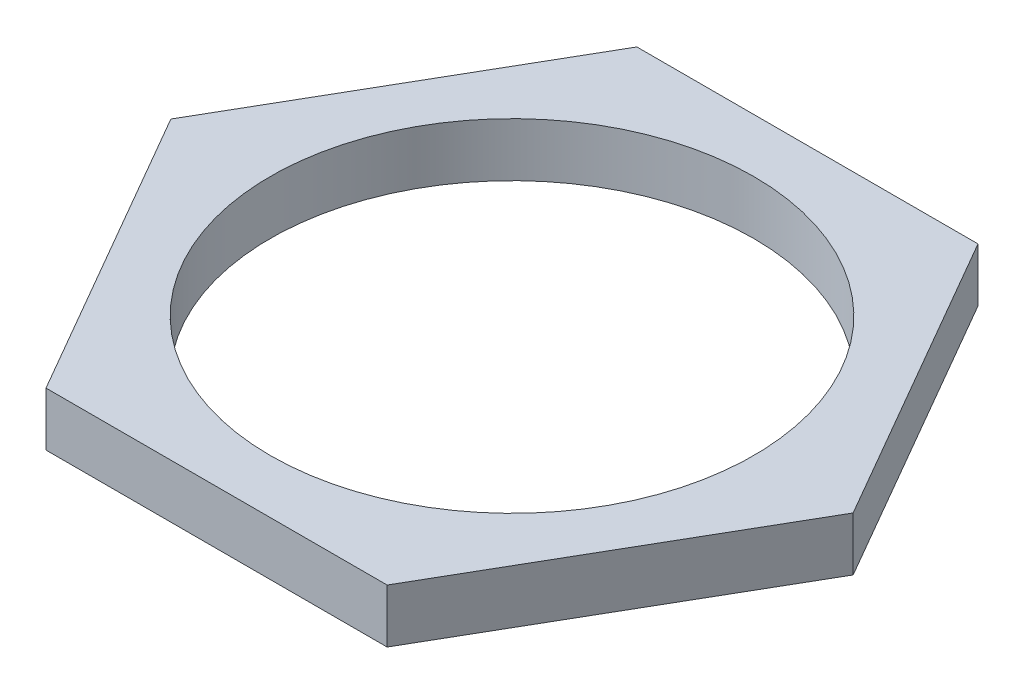
ISO-10303-21;
HEADER;
FILE_DESCRIPTION(('STEP AP214'),'2;1');
FILE_NAME('part.step','',(''),(''),'','','');
FILE_SCHEMA(('AUTOMOTIVE_DESIGN { 1 0 10303 214 1 1 1 1 }'));
ENDSEC;
DATA;
#1=APPLICATION_CONTEXT('core data for automotive mechanical design processes');
#2=APPLICATION_PROTOCOL_DEFINITION('international standard','automotive_design',2000,#1);
#3=PRODUCT_CONTEXT('',#1,'mechanical');
#4=PRODUCT('Part','Part','',(#3));
#5=PRODUCT_RELATED_PRODUCT_CATEGORY('part','',(#4));
#6=PRODUCT_DEFINITION_FORMATION('','',#4);
#7=PRODUCT_DEFINITION_CONTEXT('part definition',#1,'design');
#8=PRODUCT_DEFINITION('design','',#6,#7);
#9=PRODUCT_DEFINITION_SHAPE('','',#8);
#10=(LENGTH_UNIT() NAMED_UNIT(*) SI_UNIT(.MILLI.,.METRE.));
#11=(NAMED_UNIT(*) PLANE_ANGLE_UNIT() SI_UNIT($,.RADIAN.));
#12=(NAMED_UNIT(*) SI_UNIT($,.STERADIAN.) SOLID_ANGLE_UNIT());
#13=UNCERTAINTY_MEASURE_WITH_UNIT(LENGTH_MEASURE(1.E-05),#10,'distance_accuracy_value','');
#14=(GEOMETRIC_REPRESENTATION_CONTEXT(3) GLOBAL_UNCERTAINTY_ASSIGNED_CONTEXT((#13)) GLOBAL_UNIT_ASSIGNED_CONTEXT((#10,
#11,#12)) REPRESENTATION_CONTEXT('',''));
#15=CARTESIAN_POINT('',(0.,0.,0.));
#16=DIRECTION('',(0.,0.,1.));
#17=DIRECTION('',(1.,0.,0.));
#18=AXIS2_PLACEMENT_3D('',#15,#16,#17);
#19=CARTESIAN_POINT('',(0.,2.,0.));
#20=DIRECTION('',(0.,1.,0.));
#21=DIRECTION('',(0.,0.,1.));
#22=AXIS2_PLACEMENT_3D('',#19,#20,#21);
#23=PLANE('',#22);
#24=DIRECTION('',(1.,0.,0.));
#25=VECTOR('',#24,1.);
#26=CARTESIAN_POINT('',(-6.35085296108588,2.,11.));
#27=LINE('',#26,#25);
#28=CARTESIAN_POINT('',(-6.35085296108588,2.,11.));
#29=VERTEX_POINT('',#28);
#30=CARTESIAN_POINT('',(6.35085296108589,2.,11.));
#31=VERTEX_POINT('',#30);
#32=EDGE_CURVE('E130',#29,#31,#27,.T.);
#33=ORIENTED_EDGE('',*,*,#32,.T.);
#34=DIRECTION('',(0.5,0.,-0.866025403784439));
#35=VECTOR('',#34,1.);
#36=CARTESIAN_POINT('',(6.35085296108589,2.,11.));
#37=LINE('',#36,#35);
#38=CARTESIAN_POINT('',(12.7017059221718,2.,0.));
#39=VERTEX_POINT('',#38);
#40=EDGE_CURVE('E88',#31,#39,#37,.T.);
#41=ORIENTED_EDGE('',*,*,#40,.T.);
#42=DIRECTION('',(-0.5,0.,-0.866025403784439));
#43=VECTOR('',#42,1.);
#44=CARTESIAN_POINT('',(12.7017059221718,2.,0.));
#45=LINE('',#44,#43);
#46=CARTESIAN_POINT('',(6.35085296108589,2.,-11.));
#47=VERTEX_POINT('',#46);
#48=EDGE_CURVE('E101',#39,#47,#45,.T.);
#49=ORIENTED_EDGE('',*,*,#48,.T.);
#50=DIRECTION('',(-1.,0.,0.));
#51=VECTOR('',#50,1.);
#52=CARTESIAN_POINT('',(6.35085296108589,2.,-11.));
#53=LINE('',#52,#51);
#54=CARTESIAN_POINT('',(-6.35085296108588,2.,-11.));
#55=VERTEX_POINT('',#54);
#56=EDGE_CURVE('E95',#47,#55,#53,.T.);
#57=ORIENTED_EDGE('',*,*,#56,.T.);
#58=DIRECTION('',(-0.5,0.,0.866025403784439));
#59=VECTOR('',#58,1.);
#60=CARTESIAN_POINT('',(-6.35085296108588,2.,-11.));
#61=LINE('',#60,#59);
#62=CARTESIAN_POINT('',(-12.7017059221718,2.,0.));
#63=VERTEX_POINT('',#62);
#64=EDGE_CURVE('E99',#55,#63,#61,.T.);
#65=ORIENTED_EDGE('',*,*,#64,.T.);
#66=DIRECTION('',(0.5,0.,0.866025403784439));
#67=VECTOR('',#66,1.);
#68=CARTESIAN_POINT('',(-12.7017059221718,2.,0.));
#69=LINE('',#68,#67);
#70=EDGE_CURVE('E51',#63,#29,#69,.T.);
#71=ORIENTED_EDGE('',*,*,#70,.T.);
#72=EDGE_LOOP('',(#33,#41,#49,#57,#65,#71));
#73=FACE_BOUND('',#72,.T.);
#74=CARTESIAN_POINT('',(0.,2.,0.));
#75=DIRECTION('',(0.,1.,0.));
#76=DIRECTION('',(0.,0.,1.));
#77=AXIS2_PLACEMENT_3D('',#74,#75,#76);
#78=CIRCLE('',#77,9.);
#79=CARTESIAN_POINT('',(0.,2.,9.));
#80=VERTEX_POINT('',#79);
#81=EDGE_CURVE('E123',#80,#80,#78,.T.);
#82=ORIENTED_EDGE('',*,*,#81,.F.);
#83=EDGE_LOOP('',(#82));
#84=FACE_BOUND('',#83,.T.);
#85=ADVANCED_FACE('F34',(#73,#84),#23,.T.);
#86=CARTESIAN_POINT('',(0.,0.,0.));
#87=DIRECTION('',(0.,1.,0.));
#88=DIRECTION('',(0.,0.,1.));
#89=AXIS2_PLACEMENT_3D('',#86,#87,#88);
#90=PLANE('',#89);
#91=DIRECTION('',(1.,0.,0.));
#92=VECTOR('',#91,1.);
#93=CARTESIAN_POINT('',(-6.35085296108588,0.,11.));
#94=LINE('',#93,#92);
#95=CARTESIAN_POINT('',(-6.35085296108588,0.,11.));
#96=VERTEX_POINT('',#95);
#97=CARTESIAN_POINT('',(6.35085296108589,0.,11.));
#98=VERTEX_POINT('',#97);
#99=EDGE_CURVE('E119',#96,#98,#94,.T.);
#100=ORIENTED_EDGE('',*,*,#99,.F.);
#101=DIRECTION('',(0.5,0.,0.866025403784439));
#102=VECTOR('',#101,1.);
#103=CARTESIAN_POINT('',(-12.7017059221718,0.,0.));
#104=LINE('',#103,#102);
#105=CARTESIAN_POINT('',(-12.7017059221718,0.,0.));
#106=VERTEX_POINT('',#105);
#107=EDGE_CURVE('E80',#106,#96,#104,.T.);
#108=ORIENTED_EDGE('',*,*,#107,.F.);
#109=DIRECTION('',(-0.5,0.,0.866025403784439));
#110=VECTOR('',#109,1.);
#111=CARTESIAN_POINT('',(-6.35085296108588,0.,-11.));
#112=LINE('',#111,#110);
#113=CARTESIAN_POINT('',(-6.35085296108588,0.,-11.));
#114=VERTEX_POINT('',#113);
#115=EDGE_CURVE('E74',#114,#106,#112,.T.);
#116=ORIENTED_EDGE('',*,*,#115,.F.);
#117=DIRECTION('',(-1.,0.,0.));
#118=VECTOR('',#117,1.);
#119=CARTESIAN_POINT('',(6.35085296108589,0.,-11.));
#120=LINE('',#119,#118);
#121=CARTESIAN_POINT('',(6.35085296108589,0.,-11.));
#122=VERTEX_POINT('',#121);
#123=EDGE_CURVE('E109',#122,#114,#120,.T.);
#124=ORIENTED_EDGE('',*,*,#123,.F.);
#125=DIRECTION('',(-0.5,0.,-0.866025403784439));
#126=VECTOR('',#125,1.);
#127=CARTESIAN_POINT('',(12.7017059221718,0.,0.));
#128=LINE('',#127,#126);
#129=CARTESIAN_POINT('',(12.7017059221718,0.,0.));
#130=VERTEX_POINT('',#129);
#131=EDGE_CURVE('E125',#130,#122,#128,.T.);
#132=ORIENTED_EDGE('',*,*,#131,.F.);
#133=DIRECTION('',(0.5,0.,-0.866025403784439));
#134=VECTOR('',#133,1.);
#135=CARTESIAN_POINT('',(6.35085296108589,0.,11.));
#136=LINE('',#135,#134);
#137=EDGE_CURVE('E122',#98,#130,#136,.T.);
#138=ORIENTED_EDGE('',*,*,#137,.F.);
#139=EDGE_LOOP('',(#100,#108,#116,#124,#132,#138));
#140=FACE_BOUND('',#139,.T.);
#141=CARTESIAN_POINT('',(0.,0.,0.));
#142=DIRECTION('',(0.,1.,0.));
#143=DIRECTION('',(0.,0.,1.));
#144=AXIS2_PLACEMENT_3D('',#141,#142,#143);
#145=CIRCLE('',#144,9.);
#146=CARTESIAN_POINT('',(0.,0.,9.));
#147=VERTEX_POINT('',#146);
#148=EDGE_CURVE('E223',#147,#147,#145,.T.);
#149=ORIENTED_EDGE('',*,*,#148,.T.);
#150=EDGE_LOOP('',(#149));
#151=FACE_BOUND('',#150,.T.);
#152=ADVANCED_FACE('F139',(#140,#151),#90,.F.);
#153=CARTESIAN_POINT('',(-6.35085296108588,2.,11.));
#154=DIRECTION('',(0.,0.,-1.));
#155=DIRECTION('',(-1.,0.,0.));
#156=AXIS2_PLACEMENT_3D('',#153,#154,#155);
#157=PLANE('',#156);
#158=ORIENTED_EDGE('',*,*,#99,.T.);
#159=DIRECTION('',(0.,-1.,0.));
#160=VECTOR('',#159,1.);
#161=CARTESIAN_POINT('',(6.35085296108589,2.,11.));
#162=LINE('',#161,#160);
#163=EDGE_CURVE('E11',#31,#98,#162,.T.);
#164=ORIENTED_EDGE('',*,*,#163,.F.);
#165=ORIENTED_EDGE('',*,*,#32,.F.);
#166=DIRECTION('',(0.,-1.,0.));
#167=VECTOR('',#166,1.);
#168=CARTESIAN_POINT('',(-6.35085296108588,2.,11.));
#169=LINE('',#168,#167);
#170=EDGE_CURVE('E115',#29,#96,#169,.T.);
#171=ORIENTED_EDGE('',*,*,#170,.T.);
#172=EDGE_LOOP('',(#158,#164,#165,#171));
#173=FACE_BOUND('',#172,.T.);
#174=ADVANCED_FACE('F36',(#173),#157,.F.);
#175=CARTESIAN_POINT('',(6.35085296108589,2.,11.));
#176=DIRECTION('',(-0.866025403784439,0.,-0.5));
#177=DIRECTION('',(-0.5,0.,0.866025403784439));
#178=AXIS2_PLACEMENT_3D('',#175,#176,#177);
#179=PLANE('',#178);
#180=ORIENTED_EDGE('',*,*,#137,.T.);
#181=DIRECTION('',(0.,-1.,0.));
#182=VECTOR('',#181,1.);
#183=CARTESIAN_POINT('',(12.7017059221718,2.,0.));
#184=LINE('',#183,#182);
#185=EDGE_CURVE('E43',#39,#130,#184,.T.);
#186=ORIENTED_EDGE('',*,*,#185,.F.);
#187=ORIENTED_EDGE('',*,*,#40,.F.);
#188=ORIENTED_EDGE('',*,*,#163,.T.);
#189=EDGE_LOOP('',(#180,#186,#187,#188));
#190=FACE_BOUND('',#189,.T.);
#191=ADVANCED_FACE('F164',(#190),#179,.F.);
#192=CARTESIAN_POINT('',(12.7017059221718,2.,0.));
#193=DIRECTION('',(-0.866025403784439,0.,0.5));
#194=DIRECTION('',(0.5,0.,0.866025403784439));
#195=AXIS2_PLACEMENT_3D('',#192,#193,#194);
#196=PLANE('',#195);
#197=ORIENTED_EDGE('',*,*,#131,.T.);
#198=DIRECTION('',(0.,-1.,0.));
#199=VECTOR('',#198,1.);
#200=CARTESIAN_POINT('',(6.35085296108589,2.,-11.));
#201=LINE('',#200,#199);
#202=EDGE_CURVE('E110',#47,#122,#201,.T.);
#203=ORIENTED_EDGE('',*,*,#202,.F.);
#204=ORIENTED_EDGE('',*,*,#48,.F.);
#205=ORIENTED_EDGE('',*,*,#185,.T.);
#206=EDGE_LOOP('',(#197,#203,#204,#205));
#207=FACE_BOUND('',#206,.T.);
#208=ADVANCED_FACE('F136',(#207),#196,.F.);
#209=CARTESIAN_POINT('',(6.35085296108589,2.,-11.));
#210=DIRECTION('',(0.,0.,1.));
#211=DIRECTION('',(1.,0.,0.));
#212=AXIS2_PLACEMENT_3D('',#209,#210,#211);
#213=PLANE('',#212);
#214=ORIENTED_EDGE('',*,*,#123,.T.);
#215=DIRECTION('',(0.,-1.,0.));
#216=VECTOR('',#215,1.);
#217=CARTESIAN_POINT('',(-6.35085296108588,2.,-11.));
#218=LINE('',#217,#216);
#219=EDGE_CURVE('E106',#55,#114,#218,.T.);
#220=ORIENTED_EDGE('',*,*,#219,.F.);
#221=ORIENTED_EDGE('',*,*,#56,.F.);
#222=ORIENTED_EDGE('',*,*,#202,.T.);
#223=EDGE_LOOP('',(#214,#220,#221,#222));
#224=FACE_BOUND('',#223,.T.);
#225=ADVANCED_FACE('F107',(#224),#213,.F.);
#226=CARTESIAN_POINT('',(-6.35085296108588,2.,-11.));
#227=DIRECTION('',(0.866025403784439,0.,0.5));
#228=DIRECTION('',(0.5,0.,-0.866025403784439));
#229=AXIS2_PLACEMENT_3D('',#226,#227,#228);
#230=PLANE('',#229);
#231=ORIENTED_EDGE('',*,*,#115,.T.);
#232=DIRECTION('',(0.,-1.,0.));
#233=VECTOR('',#232,1.);
#234=CARTESIAN_POINT('',(-12.7017059221718,2.,0.));
#235=LINE('',#234,#233);
#236=EDGE_CURVE('E111',#63,#106,#235,.T.);
#237=ORIENTED_EDGE('',*,*,#236,.F.);
#238=ORIENTED_EDGE('',*,*,#64,.F.);
#239=ORIENTED_EDGE('',*,*,#219,.T.);
#240=EDGE_LOOP('',(#231,#237,#238,#239));
#241=FACE_BOUND('',#240,.T.);
#242=ADVANCED_FACE('F113',(#241),#230,.F.);
#243=CARTESIAN_POINT('',(-12.7017059221718,2.,0.));
#244=DIRECTION('',(0.866025403784439,0.,-0.5));
#245=DIRECTION('',(-0.5,0.,-0.866025403784439));
#246=AXIS2_PLACEMENT_3D('',#243,#244,#245);
#247=PLANE('',#246);
#248=ORIENTED_EDGE('',*,*,#107,.T.);
#249=ORIENTED_EDGE('',*,*,#170,.F.);
#250=ORIENTED_EDGE('',*,*,#70,.F.);
#251=ORIENTED_EDGE('',*,*,#236,.T.);
#252=EDGE_LOOP('',(#248,#249,#250,#251));
#253=FACE_BOUND('',#252,.T.);
#254=ADVANCED_FACE('F144',(#253),#247,.F.);
#255=CARTESIAN_POINT('',(0.,2.,0.));
#256=DIRECTION('',(0.,-1.,0.));
#257=DIRECTION('',(0.,0.,-1.));
#258=AXIS2_PLACEMENT_3D('',#255,#256,#257);
#259=CYLINDRICAL_SURFACE('',#258,9.);
#260=ORIENTED_EDGE('',*,*,#81,.T.);
#261=EDGE_LOOP('',(#260));
#262=FACE_BOUND('',#261,.T.);
#263=ORIENTED_EDGE('',*,*,#148,.F.);
#264=EDGE_LOOP('',(#263));
#265=FACE_BOUND('',#264,.T.);
#266=ADVANCED_FACE('F146',(#262,#265),#259,.F.);
#267=CLOSED_SHELL('',(#85,#152,#174,#191,#208,#225,#242,#254,#266));
#268=MANIFOLD_SOLID_BREP('B2',#267);
#269=ADVANCED_BREP_SHAPE_REPRESENTATION('',(#18,#268),#14);
#270=SHAPE_DEFINITION_REPRESENTATION(#9,#269);
ENDSEC;
END-ISO-10303-21;
